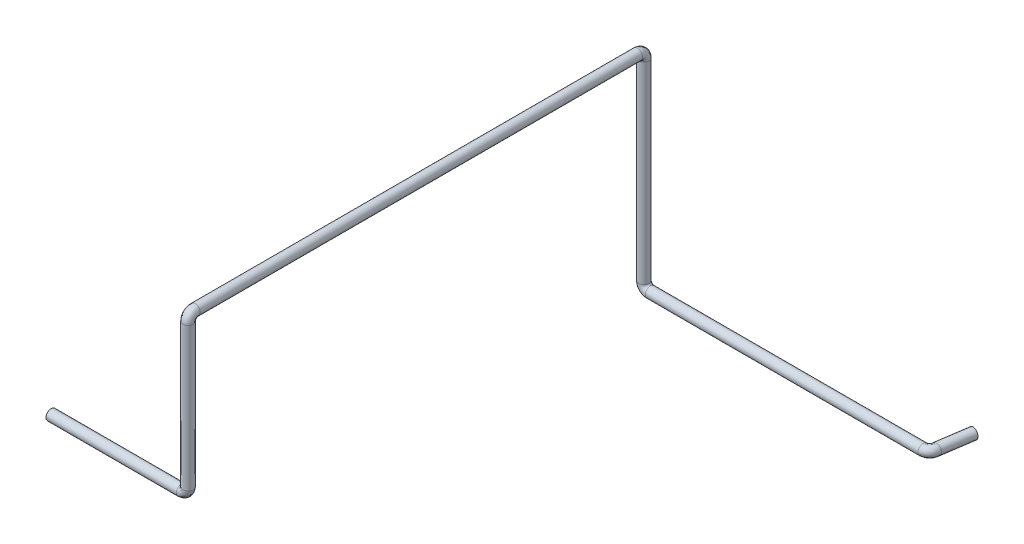
ISO-10303-21;
HEADER;
FILE_DESCRIPTION(('STEP AP214'),'2;1');
FILE_NAME('part.step','',(''),(''),'','','');
FILE_SCHEMA(('AUTOMOTIVE_DESIGN { 1 0 10303 214 1 1 1 1 }'));
ENDSEC;
DATA;
#1=APPLICATION_CONTEXT('core data for automotive mechanical design processes');
#2=APPLICATION_PROTOCOL_DEFINITION('international standard','automotive_design',2000,#1);
#3=PRODUCT_CONTEXT('',#1,'mechanical');
#4=PRODUCT('Part','Part','',(#3));
#5=PRODUCT_RELATED_PRODUCT_CATEGORY('part','',(#4));
#6=PRODUCT_DEFINITION_FORMATION('','',#4);
#7=PRODUCT_DEFINITION_CONTEXT('part definition',#1,'design');
#8=PRODUCT_DEFINITION('design','',#6,#7);
#9=PRODUCT_DEFINITION_SHAPE('','',#8);
#10=(LENGTH_UNIT() NAMED_UNIT(*) SI_UNIT(.MILLI.,.METRE.));
#11=(NAMED_UNIT(*) PLANE_ANGLE_UNIT() SI_UNIT($,.RADIAN.));
#12=(NAMED_UNIT(*) SI_UNIT($,.STERADIAN.) SOLID_ANGLE_UNIT());
#13=UNCERTAINTY_MEASURE_WITH_UNIT(LENGTH_MEASURE(1.E-05),#10,'distance_accuracy_value','');
#14=(GEOMETRIC_REPRESENTATION_CONTEXT(3) GLOBAL_UNCERTAINTY_ASSIGNED_CONTEXT((#13)) GLOBAL_UNIT_ASSIGNED_CONTEXT((#10,
#11,#12)) REPRESENTATION_CONTEXT('',''));
#15=CARTESIAN_POINT('',(0.,0.,0.));
#16=DIRECTION('',(0.,0.,1.));
#17=DIRECTION('',(1.,0.,0.));
#18=AXIS2_PLACEMENT_3D('',#15,#16,#17);
#19=CARTESIAN_POINT('',(21.9957932553289,-7.67008921079768,-69.9458668358255));
#20=DIRECTION('',(0.999999964203966,-0.00026756693960462,1.17321939738201E-12));
#21=DIRECTION('',(1.17290567079506E-12,-1.17267317397372E-12,-1.));
#22=AXIS2_PLACEMENT_3D('',#19,#20,#21);
#23=CIRCLE('',#22,0.793749999999999);
#24=DIRECTION('',(1.,0.,0.));
#25=VECTOR('',#24,1.);
#26=SURFACE_OF_LINEAR_EXTRUSION('',#23,#25);
#27=CARTESIAN_POINT('',(21.9955808740706,-8.46383918238458,-69.9458668358255));
#28=VERTEX_POINT('',#27);
#29=EDGE_CURVE('E62',#28,#28,#23,.T.);
#30=ORIENTED_EDGE('',*,*,#29,.T.);
#31=EDGE_LOOP('',(#30));
#32=FACE_BOUND('',#31,.T.);
#33=CARTESIAN_POINT('',(63.8407932553289,-7.67008921079768,-69.9458668358255));
#34=DIRECTION('',(0.999999964203966,-0.00026756693960462,1.17321939738201E-12));
#35=DIRECTION('',(1.17290567079506E-12,-1.17267317397372E-12,-1.));
#36=AXIS2_PLACEMENT_3D('',#33,#34,#35);
#37=CIRCLE('',#36,0.793749999999999);
#38=CARTESIAN_POINT('',(63.8407932553298,-7.67008921079861,-70.7396168358255));
#39=VERTEX_POINT('',#38);
#40=EDGE_CURVE('E11',#39,#39,#37,.T.);
#41=ORIENTED_EDGE('',*,*,#40,.F.);
#42=EDGE_LOOP('',(#41));
#43=FACE_BOUND('',#42,.T.);
#44=ADVANCED_FACE('F56',(#32,#43),#26,.T.);
#45=CARTESIAN_POINT('',(21.9960608222685,-6.6700892465937,-69.9458668358255));
#46=DIRECTION('',(-1.17267306976032E-12,0.,1.));
#47=DIRECTION('',(1.,0.,1.17267306976032E-12));
#48=AXIS2_PLACEMENT_3D('',#45,#46,#47);
#49=TOROIDAL_SURFACE('',#48,1.00000000000001,0.793749999999999);
#50=CARTESIAN_POINT('',(20.9960608222685,-6.6700892465937,-69.9458668358267));
#51=DIRECTION('',(0.,-1.,0.));
#52=DIRECTION('',(0.,0.,-1.));
#53=AXIS2_PLACEMENT_3D('',#50,#51,#52);
#54=CIRCLE('',#53,0.793749999999999);
#55=CARTESIAN_POINT('',(20.2023108222685,-6.6700892465937,-69.9458668358276));
#56=VERTEX_POINT('',#55);
#57=EDGE_CURVE('E95',#56,#56,#54,.T.);
#58=CARTESIAN_POINT('',(21.9960608222685,-6.6700892465937,-69.9458668358255));
#59=DIRECTION('',(-1.17267306976032E-12,0.,1.));
#60=DIRECTION('',(1.,0.,1.17267306976032E-12));
#61=AXIS2_PLACEMENT_3D('',#58,#59,#60);
#62=CIRCLE('',#61,1.79375000000001);
#63=EDGE_CURVE('',#56,#28,#62,.T.);
#64=ORIENTED_EDGE('',*,*,#57,.T.);
#65=ORIENTED_EDGE('',*,*,#29,.F.);
#66=ORIENTED_EDGE('',*,*,#63,.T.);
#67=ORIENTED_EDGE('',*,*,#63,.F.);
#68=EDGE_LOOP('',(#64,#66,#65,#67));
#69=FACE_BOUND('',#68,.T.);
#70=ADVANCED_FACE('F143',(#69),#49,.T.);
#71=CARTESIAN_POINT('',(20.,0.,0.));
#72=DIRECTION('',(-1.,0.,0.));
#73=DIRECTION('',(0.,0.,1.));
#74=AXIS2_PLACEMENT_3D('',#71,#72,#73);
#75=CYLINDRICAL_SURFACE('',#74,0.793749999999999);
#76=CARTESIAN_POINT('',(20.,0.,0.));
#77=DIRECTION('',(1.,0.,0.));
#78=DIRECTION('',(0.,0.,-1.));
#79=AXIS2_PLACEMENT_3D('',#76,#77,#78);
#80=CIRCLE('',#79,0.793749999999999);
#81=CARTESIAN_POINT('',(20.,0.,-0.793749999999999));
#82=VERTEX_POINT('',#81);
#83=EDGE_CURVE('E66',#82,#82,#80,.T.);
#84=ORIENTED_EDGE('',*,*,#83,.F.);
#85=EDGE_LOOP('',(#84));
#86=FACE_BOUND('',#85,.T.);
#87=CARTESIAN_POINT('',(0.,0.,0.));
#88=DIRECTION('',(1.,0.,0.));
#89=DIRECTION('',(0.,0.,-1.));
#90=AXIS2_PLACEMENT_3D('',#87,#88,#89);
#91=CIRCLE('',#90,0.793749999999999);
#92=CARTESIAN_POINT('',(0.,0.,-0.793749999999999));
#93=VERTEX_POINT('',#92);
#94=EDGE_CURVE('E70',#93,#93,#91,.T.);
#95=ORIENTED_EDGE('',*,*,#94,.T.);
#96=EDGE_LOOP('',(#95));
#97=FACE_BOUND('',#96,.T.);
#98=ADVANCED_FACE('F147',(#86,#97),#75,.T.);
#99=CARTESIAN_POINT('',(0.,0.,0.));
#100=DIRECTION('',(1.,0.,0.));
#101=DIRECTION('',(0.,0.,-1.));
#102=AXIS2_PLACEMENT_3D('',#99,#100,#101);
#103=PLANE('',#102);
#104=ORIENTED_EDGE('',*,*,#94,.F.);
#105=EDGE_LOOP('',(#104));
#106=FACE_BOUND('',#105,.T.);
#107=ADVANCED_FACE('F153',(#106),#103,.F.);
#108=CARTESIAN_POINT('',(20.,0.,-0.793749999999999));
#109=CARTESIAN_POINT('',(20.065279770204,0.,-0.793749999999999));
#110=CARTESIAN_POINT('',(20.1914878893359,0.0132172628994147,-0.79375));
#111=CARTESIAN_POINT('',(20.3996616530544,0.0772373758963046,-0.793749999999999));
#112=CARTESIAN_POINT('',(20.5896732684097,0.183509851019247,-0.793749999999999));
#113=CARTESIAN_POINT('',(20.7435293441814,0.319747904994038,-0.793749999999999));
#114=CARTESIAN_POINT('',(20.8740212526352,0.500909275893164,-0.793749999999999));
#115=CARTESIAN_POINT('',(20.9637701763745,0.712330300778528,-0.793749999999999));
#116=CARTESIAN_POINT('',(20.9899883978973,0.843115742960347,-0.793749999999999));
#117=CARTESIAN_POINT('',(20.9960608222739,0.911327352972007,-0.793749999999999));
#118=CARTESIAN_POINT('',(20.,1.5875,-0.793749999999999));
#119=CARTESIAN_POINT('',(20.065279770204,1.5875,-0.793749999999999));
#120=CARTESIAN_POINT('',(19.8038514776803,1.57619079827259,-0.793749999999999));
#121=CARTESIAN_POINT('',(19.7677475950457,1.53971736077893,-0.793749999999999));
#122=CARTESIAN_POINT('',(19.6385541781513,1.47434908763946,-0.793749999999999));
#123=CARTESIAN_POINT('',(19.5239226471976,1.36242127183502,-0.793749999999999));
#124=CARTESIAN_POINT('',(19.4533703039128,1.22491108057865,-0.793749999999998));
#125=CARTESIAN_POINT('',(19.4216012684054,1.18681215509875,-0.793749999999998));
#126=CARTESIAN_POINT('',(19.4024883978973,0.913638557488902,-0.793749999999998));
#127=CARTESIAN_POINT('',(19.4085608222739,0.981850167500561,-0.793749999999998));
#128=CARTESIAN_POINT('',(20.,1.5875,0.793749999999999));
#129=CARTESIAN_POINT('',(20.065279770204,1.5875,0.793749999999999));
#130=CARTESIAN_POINT('',(19.8038514776803,1.57619079827259,0.793749999999999));
#131=CARTESIAN_POINT('',(19.7677475950457,1.53971736077893,0.793749999999999));
#132=CARTESIAN_POINT('',(19.6385541781513,1.47434908763946,0.793749999999999));
#133=CARTESIAN_POINT('',(19.5239226471976,1.36242127183502,0.79375));
#134=CARTESIAN_POINT('',(19.4533703039128,1.22491108057865,0.79375));
#135=CARTESIAN_POINT('',(19.4216012684054,1.18681215509875,0.79375));
#136=CARTESIAN_POINT('',(19.4024883978973,0.913638557488902,0.793750000000001));
#137=CARTESIAN_POINT('',(19.4085608222739,0.981850167500561,0.793750000000001));
#138=CARTESIAN_POINT('',(20.,0.,0.793749999999999));
#139=CARTESIAN_POINT('',(20.065279770204,0.,0.793749999999999));
#140=CARTESIAN_POINT('',(20.1914878893359,0.0132172628994146,0.79375));
#141=CARTESIAN_POINT('',(20.3996616530544,0.0772373758963046,0.793749999999999));
#142=CARTESIAN_POINT('',(20.5896732684097,0.183509851019247,0.793749999999999));
#143=CARTESIAN_POINT('',(20.7435293441814,0.319747904994038,0.793749999999999));
#144=CARTESIAN_POINT('',(20.8740212526352,0.500909275893164,0.793749999999999));
#145=CARTESIAN_POINT('',(20.9637701763745,0.712330300778528,0.793749999999999));
#146=CARTESIAN_POINT('',(20.9899883978973,0.843115742960347,0.793749999999999));
#147=CARTESIAN_POINT('',(20.9960608222739,0.911327352972007,0.793749999999999));
#148=CARTESIAN_POINT('',(20.,-1.5875,0.79375));
#149=CARTESIAN_POINT('',(20.065279770204,-1.5875,0.79375));
#150=CARTESIAN_POINT('',(20.5791243009916,-1.54975627247376,0.793749999999999));
#151=CARTESIAN_POINT('',(21.031575711063,-1.38524260898632,0.79375));
#152=CARTESIAN_POINT('',(21.540792358668,-1.10732938560097,0.793749999999999));
#153=CARTESIAN_POINT('',(21.9631360411653,-0.722925461846948,0.79375));
#154=CARTESIAN_POINT('',(22.2946722013576,-0.223092528792315,0.793749999999998));
#155=CARTESIAN_POINT('',(22.5059390843435,0.237848446458302,0.793749999999998));
#156=CARTESIAN_POINT('',(22.5774883978973,0.772592928431793,0.793749999999998));
#157=CARTESIAN_POINT('',(22.5835608222739,0.840804538443452,0.793749999999998));
#158=CARTESIAN_POINT('',(20.,-1.5875,-0.793749999999999));
#159=CARTESIAN_POINT('',(20.065279770204,-1.5875,-0.793749999999999));
#160=CARTESIAN_POINT('',(20.5791243009916,-1.54975627247376,-0.793749999999999));
#161=CARTESIAN_POINT('',(21.031575711063,-1.38524260898632,-0.793749999999999));
#162=CARTESIAN_POINT('',(21.540792358668,-1.10732938560097,-0.79375));
#163=CARTESIAN_POINT('',(21.9631360411653,-0.722925461846948,-0.79375));
#164=CARTESIAN_POINT('',(22.2946722013576,-0.223092528792315,-0.79375));
#165=CARTESIAN_POINT('',(22.5059390843435,0.237848446458302,-0.79375));
#166=CARTESIAN_POINT('',(22.5774883978973,0.772592928431793,-0.793750000000001));
#167=CARTESIAN_POINT('',(22.5835608222739,0.840804538443452,-0.793750000000001));
#168=CARTESIAN_POINT('',(20.,0.,-0.793749999999999));
#169=CARTESIAN_POINT('',(20.065279770204,0.,-0.793749999999999));
#170=CARTESIAN_POINT('',(20.1914878893359,0.0132172628994147,-0.79375));
#171=CARTESIAN_POINT('',(20.3996616530544,0.0772373758963046,-0.793749999999999));
#172=CARTESIAN_POINT('',(20.5896732684097,0.183509851019247,-0.793749999999999));
#173=CARTESIAN_POINT('',(20.7435293441814,0.319747904994038,-0.793749999999999));
#174=CARTESIAN_POINT('',(20.8740212526352,0.500909275893164,-0.793749999999999));
#175=CARTESIAN_POINT('',(20.9637701763745,0.712330300778528,-0.793749999999999));
#176=CARTESIAN_POINT('',(20.9899883978973,0.843115742960347,-0.793749999999999));
#177=CARTESIAN_POINT('',(20.9960608222739,0.911327352972007,-0.793749999999999));
#178=(BOUNDED_SURFACE() B_SPLINE_SURFACE(3,3,((#108,#109,#110,#111,#112,#113,#114,#115,#116,
#117),(#118,#119,#120,#121,#122,#123,#124,#125,#126,#127),(#128,#129,#130,#131,#132,#133,#134,
#135,#136,#137),(#138,#139,#140,#141,#142,#143,#144,#145,#146,#147),(#148,#149,#150,#151,#152,
#153,#154,#155,#156,#157),(#158,#159,#160,#161,#162,#163,#164,#165,#166,#167),(#168,#169,#170,
#171,#172,#173,#174,#175,#176,#177)),.UNSPECIFIED.,.T.,.F.,.F.) B_SPLINE_SURFACE_WITH_KNOTS((4,
3,4),(4,1,1,1,1,1,1,4),(0.,0.5,1.),(0.,0.136322147353387,0.271272815336725,0.413325279073055,
0.565638666076814,0.715713661766442,0.857326161375628,1.),
.UNSPECIFIED.) GEOMETRIC_REPRESENTATION_ITEM() RATIONAL_B_SPLINE_SURFACE(((1.,1.,1.,1.,1.,1.,1.,
1.,1.,1.),(0.333333333333333,0.333333333333333,0.333333333333333,0.333333333333333,
0.333333333333333,0.333333333333333,0.333333333333333,0.333333333333333,0.333333333333333,
0.333333333333333),(0.333333333333333,0.333333333333333,0.333333333333333,0.333333333333333,
0.333333333333333,0.333333333333333,0.333333333333333,0.333333333333333,0.333333333333333,
0.333333333333333),(1.,1.,1.,1.,1.,1.,1.,1.,1.,1.),(0.333333333333333,0.333333333333333,
0.333333333333333,0.333333333333333,0.333333333333333,0.333333333333333,0.333333333333333,
0.333333333333333,0.333333333333333,0.333333333333333),(0.333333333333333,0.333333333333333,
0.333333333333333,0.333333333333333,0.333333333333333,0.333333333333333,0.333333333333333,
0.333333333333333,0.333333333333333,0.333333333333333),(1.,1.,1.,1.,1.,1.,1.,1.,1.,1.))) REPRESENTATION_ITEM('') SURFACE());
#179=CARTESIAN_POINT('',(20.9960608222739,0.911327352972007,-0.793749999999999));
#180=CARTESIAN_POINT('',(22.5835608222739,0.840804538443452,-0.793750000000001));
#181=CARTESIAN_POINT('',(22.5835608222739,0.840804538443452,0.793749999999998));
#182=CARTESIAN_POINT('',(20.9960608222739,0.911327352972007,0.793749999999999));
#183=CARTESIAN_POINT('',(19.4085608222739,0.981850167500561,0.793750000000001));
#184=CARTESIAN_POINT('',(19.4085608222739,0.981850167500561,-0.793749999999998));
#185=CARTESIAN_POINT('',(20.9960608222739,0.911327352972007,-0.793749999999999));
#186=(BOUNDED_CURVE() B_SPLINE_CURVE(3,(#179,#180,#181,#182,#183,#184,#185),.UNSPECIFIED.,.T.,
.F.) B_SPLINE_CURVE_WITH_KNOTS((4,3,4),(0.,0.5,1.),
.UNSPECIFIED.) CURVE() GEOMETRIC_REPRESENTATION_ITEM() RATIONAL_B_SPLINE_CURVE((1.,
0.333333333333333,0.333333333333333,1.,0.333333333333333,0.333333333333333,1.)) REPRESENTATION_ITEM(''));
#187=CARTESIAN_POINT('',(20.9960608222739,0.911327352972007,-0.793749999999999));
#188=VERTEX_POINT('',#187);
#189=EDGE_CURVE('E79',#188,#188,#186,.T.);
#190=ORIENTED_EDGE('',*,*,#83,.T.);
#191=EDGE_LOOP('',(#190));
#192=FACE_BOUND('',#191,.T.);
#193=ORIENTED_EDGE('',*,*,#189,.T.);
#194=EDGE_LOOP('',(#193));
#195=FACE_BOUND('',#194,.T.);
#196=ADVANCED_FACE('F160',(#192,#195),#178,.T.);
#197=CARTESIAN_POINT('',(20.9960608222739,0.911327352972007,-0.793749999999999));
#198=CARTESIAN_POINT('',(20.9960608222739,22.911327352972,-0.793749999999999));
#199=CARTESIAN_POINT('',(22.5835608222739,0.840804538443452,-0.793750000000001));
#200=CARTESIAN_POINT('',(22.5835608222739,22.911327352972,-0.793750000000001));
#201=CARTESIAN_POINT('',(22.5835608222739,0.840804538443452,0.793749999999998));
#202=CARTESIAN_POINT('',(22.5835608222739,22.911327352972,0.793749999999998));
#203=CARTESIAN_POINT('',(20.9960608222739,0.911327352972007,0.793749999999999));
#204=CARTESIAN_POINT('',(20.9960608222739,22.911327352972,0.793749999999999));
#205=CARTESIAN_POINT('',(19.4085608222739,0.981850167500561,0.793750000000001));
#206=CARTESIAN_POINT('',(19.4085608222739,22.911327352972,0.793750000000001));
#207=CARTESIAN_POINT('',(19.4085608222739,0.981850167500561,-0.793749999999998));
#208=CARTESIAN_POINT('',(19.4085608222739,22.911327352972,-0.793749999999998));
#209=CARTESIAN_POINT('',(20.9960608222739,0.911327352972007,-0.793749999999999));
#210=CARTESIAN_POINT('',(20.9960608222739,22.911327352972,-0.793749999999999));
#211=(BOUNDED_SURFACE() B_SPLINE_SURFACE(3,1,((#197,#198),(#199,#200),(#201,#202),(#203,#204),
(#205,#206),(#207,#208),(#209,#210)),.UNSPECIFIED.,.T.,.F.,.F.) B_SPLINE_SURFACE_WITH_KNOTS((4,
3,4),(2,2),(0.,0.5,1.),(0.,1.),
.UNSPECIFIED.) GEOMETRIC_REPRESENTATION_ITEM() RATIONAL_B_SPLINE_SURFACE(((1.,1.),
(0.333333333333333,0.333333333333333),(0.333333333333333,0.333333333333333),(1.,1.),
(0.333333333333333,0.333333333333333),(0.333333333333333,0.333333333333333),(1.,1.))) REPRESENTATION_ITEM('') SURFACE());
#212=CARTESIAN_POINT('',(20.9960608222739,22.911327352972,0.));
#213=DIRECTION('',(0.,1.,0.));
#214=DIRECTION('',(-1.,0.,0.));
#215=AXIS2_PLACEMENT_3D('',#212,#213,#214);
#216=CIRCLE('',#215,0.793749999999999);
#217=CARTESIAN_POINT('',(20.2023108222739,22.911327352972,0.));
#218=VERTEX_POINT('',#217);
#219=EDGE_CURVE('E75',#218,#218,#216,.T.);
#220=ORIENTED_EDGE('',*,*,#189,.F.);
#221=EDGE_LOOP('',(#220));
#222=FACE_BOUND('',#221,.T.);
#223=ORIENTED_EDGE('',*,*,#219,.F.);
#224=EDGE_LOOP('',(#223));
#225=FACE_BOUND('',#224,.T.);
#226=ADVANCED_FACE('F166',(#222,#225),#211,.F.);
#227=CARTESIAN_POINT('',(20.2023108222739,22.911327352972,0.));
#228=CARTESIAN_POINT('',(20.2023108222739,22.9669699019746,-0.00294481803164178));
#229=CARTESIAN_POINT('',(20.2023108222739,23.0769147564352,-0.00876352324384745));
#230=CARTESIAN_POINT('',(20.2023108222736,23.2594855599602,-0.0601959848019615));
#231=CARTESIAN_POINT('',(20.2023108222732,23.4330763366588,-0.142448008621294));
#232=CARTESIAN_POINT('',(20.2023108222726,23.5892678850576,-0.256628990866869));
#233=CARTESIAN_POINT('',(20.202310822272,23.7113560267948,-0.390586228220545));
#234=CARTESIAN_POINT('',(20.2023108222711,23.810559029688,-0.553946175697841));
#235=CARTESIAN_POINT('',(20.2023108222702,23.8764317607984,-0.733052526236658));
#236=CARTESIAN_POINT('',(20.2023108222694,23.9109992771942,-0.897004843017336));
#237=CARTESIAN_POINT('',(20.2023108222688,23.9092533815458,-1.01900501064942));
#238=CARTESIAN_POINT('',(20.2023108222685,23.9084383452381,-1.07595833788131));
#239=CARTESIAN_POINT('',(20.2023108222739,22.911327352972,1.5875));
#240=CARTESIAN_POINT('',(20.2023108222739,23.0647702590365,1.57916672380656));
#241=CARTESIAN_POINT('',(20.2023108222739,23.3679601429955,1.56270089226773));
#242=CARTESIAN_POINT('',(20.202310822273,23.8161749474953,1.43414806013336));
#243=CARTESIAN_POINT('',(20.2023108222723,24.2471071774012,1.23111673153646));
#244=CARTESIAN_POINT('',(20.2023108222706,24.6532955569666,0.936354774630397));
#245=CARTESIAN_POINT('',(20.2023108222685,24.9942282565509,0.562876855174698));
#246=CARTESIAN_POINT('',(20.2023108222663,25.248518606552,0.138425177014904));
#247=CARTESIAN_POINT('',(20.2023108222644,25.4114602640327,-0.299560008137403));
#248=CARTESIAN_POINT('',(20.2023108222623,25.4967264501313,-0.723651212254224));
#249=CARTESIAN_POINT('',(20.2023108222609,25.4961891656868,-1.00499690306889));
#250=CARTESIAN_POINT('',(20.2023108222603,25.4959383452381,-1.13633748648984));
#251=CARTESIAN_POINT('',(21.7898108222739,22.911327352972,1.5875));
#252=CARTESIAN_POINT('',(21.7898108222739,23.064770259037,1.57916672380652));
#253=CARTESIAN_POINT('',(21.7898108222739,23.3679601429969,1.5627008922676));
#254=CARTESIAN_POINT('',(21.789810822273,23.8161749474983,1.43414806013305));
#255=CARTESIAN_POINT('',(21.7898108222723,24.2471071774052,1.23111673153523));
#256=CARTESIAN_POINT('',(21.7898108222705,24.653295556972,0.936354774628486));
#257=CARTESIAN_POINT('',(21.7898108222685,24.9942282565577,0.562876855171618));
#258=CARTESIAN_POINT('',(21.7898108222663,25.2485186065595,0.138425177010345));
#259=CARTESIAN_POINT('',(21.7898108222644,25.4114602640405,-0.299560008142807));
#260=CARTESIAN_POINT('',(21.7898108222623,25.4967264501391,-0.723651212262655));
#261=CARTESIAN_POINT('',(21.7898108222609,25.4961891656949,-1.00499690307453));
#262=CARTESIAN_POINT('',(21.7898108222603,25.4959383452463,-1.13633748649416));
#263=CARTESIAN_POINT('',(21.7898108222739,22.911327352972,0.));
#264=CARTESIAN_POINT('',(21.7898108222739,22.9669699019751,-0.00294481803168381));
#265=CARTESIAN_POINT('',(21.7898108222739,23.0769147564367,-0.00876352324397274));
#266=CARTESIAN_POINT('',(21.7898108222736,23.2594855599631,-0.0601959848022707));
#267=CARTESIAN_POINT('',(21.7898108222732,23.4330763366628,-0.14244800862252));
#268=CARTESIAN_POINT('',(21.7898108222726,23.589267885063,-0.25662899086878));
#269=CARTESIAN_POINT('',(21.7898108222719,23.7113560268016,-0.390586228223626));
#270=CARTESIAN_POINT('',(21.7898108222711,23.8105590296955,-0.553946175702403));
#271=CARTESIAN_POINT('',(21.7898108222702,23.8764317608062,-0.733052526242061));
#272=CARTESIAN_POINT('',(21.7898108222694,23.910999277202,-0.897004843025767));
#273=CARTESIAN_POINT('',(21.7898108222688,23.9092533815539,-1.01900501065505));
#274=CARTESIAN_POINT('',(21.7898108222685,23.9084383452463,-1.07595833788564));
#275=CARTESIAN_POINT('',(21.7898108222739,22.911327352972,-1.5875));
#276=CARTESIAN_POINT('',(21.7898108222739,22.8691695449132,-1.58505635986989));
#277=CARTESIAN_POINT('',(21.7898108222739,22.7858693698764,-1.58022793875555));
#278=CARTESIAN_POINT('',(21.7898108222743,22.7027961724279,-1.55454002973759));
#279=CARTESIAN_POINT('',(21.7898108222742,22.6190454959204,-1.51601274878027));
#280=CARTESIAN_POINT('',(21.7898108222747,22.525240213154,-1.44961275636604));
#281=CARTESIAN_POINT('',(21.7898108222754,22.4284837970454,-1.34404931161887));
#282=CARTESIAN_POINT('',(21.7898108222759,22.3725994528315,-1.24631752841515));
#283=CARTESIAN_POINT('',(21.7898108222761,22.3414032575718,-1.16654504434132));
#284=CARTESIAN_POINT('',(21.7898108222764,22.325272104265,-1.07035847378888));
#285=CARTESIAN_POINT('',(21.7898108222766,22.322317597413,-1.03301311823557));
#286=CARTESIAN_POINT('',(21.7898108222767,22.3209383452463,-1.01557918927711));
#287=CARTESIAN_POINT('',(20.2023108222739,22.911327352972,-1.5875));
#288=CARTESIAN_POINT('',(20.2023108222739,22.8691695449127,-1.58505635986984));
#289=CARTESIAN_POINT('',(20.2023108222739,22.7858693698749,-1.58022793875543));
#290=CARTESIAN_POINT('',(20.2023108222743,22.702796172425,-1.55454002973728));
#291=CARTESIAN_POINT('',(20.2023108222742,22.6190454959163,-1.51601274877904));
#292=CARTESIAN_POINT('',(20.2023108222747,22.5252402131486,-1.44961275636413));
#293=CARTESIAN_POINT('',(20.2023108222754,22.4284837970387,-1.3440493116158));
#294=CARTESIAN_POINT('',(20.2023108222759,22.372599452824,-1.24631752841059));
#295=CARTESIAN_POINT('',(20.2023108222761,22.341403257564,-1.16654504433591));
#296=CARTESIAN_POINT('',(20.2023108222764,22.3252721042571,-1.07035847378045));
#297=CARTESIAN_POINT('',(20.2023108222766,22.3223175974049,-1.03301311822994));
#298=CARTESIAN_POINT('',(20.2023108222767,22.3209383452381,-1.01557918927278));
#299=CARTESIAN_POINT('',(20.2023108222739,22.911327352972,0.));
#300=CARTESIAN_POINT('',(20.2023108222739,22.9669699019746,-0.00294481803164178));
#301=CARTESIAN_POINT('',(20.2023108222739,23.0769147564352,-0.00876352324384745));
#302=CARTESIAN_POINT('',(20.2023108222736,23.2594855599602,-0.0601959848019615));
#303=CARTESIAN_POINT('',(20.2023108222732,23.4330763366588,-0.142448008621294));
#304=CARTESIAN_POINT('',(20.2023108222726,23.5892678850576,-0.256628990866869));
#305=CARTESIAN_POINT('',(20.202310822272,23.7113560267948,-0.390586228220545));
#306=CARTESIAN_POINT('',(20.2023108222711,23.810559029688,-0.553946175697841));
#307=CARTESIAN_POINT('',(20.2023108222702,23.8764317607984,-0.733052526236658));
#308=CARTESIAN_POINT('',(20.2023108222694,23.9109992771942,-0.897004843017336));
#309=CARTESIAN_POINT('',(20.2023108222688,23.9092533815458,-1.01900501064942));
#310=CARTESIAN_POINT('',(20.2023108222685,23.9084383452381,-1.07595833788131));
#311=(BOUNDED_SURFACE() B_SPLINE_SURFACE(3,3,((#227,#228,#229,#230,#231,#232,#233,#234,#235,
#236,#237,#238),(#239,#240,#241,#242,#243,#244,#245,#246,#247,#248,#249,#250),(#251,#252,#253,
#254,#255,#256,#257,#258,#259,#260,#261,#262),(#263,#264,#265,#266,#267,#268,#269,#270,#271,
#272,#273,#274),(#275,#276,#277,#278,#279,#280,#281,#282,#283,#284,#285,#286),(#287,#288,#289,
#290,#291,#292,#293,#294,#295,#296,#297,#298),(#299,#300,#301,#302,#303,#304,#305,#306,#307,
#308,#309,#310)),.UNSPECIFIED.,.T.,.F.,.F.) B_SPLINE_SURFACE_WITH_KNOTS((4,3,4),(4,1,1,1,1,1,1,
1,1,4),(0.,0.5,1.),(0.,0.110539535056959,0.218416541151145,0.329732005820936,0.448982114577769,
0.575716882163067,0.692249724299027,0.801320943722561,0.907250674110412,1.),
.UNSPECIFIED.) GEOMETRIC_REPRESENTATION_ITEM() RATIONAL_B_SPLINE_SURFACE(((1.,1.,1.,1.,1.,1.,1.,
1.,1.,1.,1.,1.),(0.333333333333333,0.333333333333333,0.333333333333333,0.333333333333334,
0.333333333333333,0.333333333333333,0.333333333333333,0.333333333333333,0.333333333333333,
0.333333333333333,0.333333333333333,0.333333333333333),(0.333333333333333,0.333333333333333,
0.333333333333333,0.333333333333334,0.333333333333333,0.333333333333333,0.333333333333333,
0.333333333333333,0.333333333333333,0.333333333333333,0.333333333333333,0.333333333333333),(1.,
1.,1.,1.,1.,1.,1.,1.,1.,1.,1.,1.),(0.333333333333333,0.333333333333333,0.333333333333333,
0.333333333333334,0.333333333333333,0.333333333333333,0.333333333333333,0.333333333333333,
0.333333333333333,0.333333333333333,0.333333333333333,0.333333333333333),(0.333333333333333,
0.333333333333333,0.333333333333333,0.333333333333334,0.333333333333333,0.333333333333333,
0.333333333333333,0.333333333333333,0.333333333333333,0.333333333333333,0.333333333333333,
0.333333333333333),(1.,1.,1.,1.,1.,1.,1.,1.,1.,1.,1.,1.))) REPRESENTATION_ITEM('') SURFACE());
#312=CARTESIAN_POINT('',(20.2023108222685,23.9084383452381,-1.07595833788131));
#313=CARTESIAN_POINT('',(20.2023108222767,22.3209383452381,-1.01557918927278));
#314=CARTESIAN_POINT('',(21.7898108222767,22.3209383452463,-1.01557918927711));
#315=CARTESIAN_POINT('',(21.7898108222685,23.9084383452463,-1.07595833788563));
#316=CARTESIAN_POINT('',(21.7898108222603,25.4959383452463,-1.13633748649416));
#317=CARTESIAN_POINT('',(20.2023108222603,25.4959383452381,-1.13633748648984));
#318=CARTESIAN_POINT('',(20.2023108222685,23.9084383452381,-1.07595833788131));
#319=(BOUNDED_CURVE() B_SPLINE_CURVE(3,(#312,#313,#314,#315,#316,#317,#318),.UNSPECIFIED.,.T.,
.F.) B_SPLINE_CURVE_WITH_KNOTS((4,3,4),(0.,0.5,1.),
.UNSPECIFIED.) CURVE() GEOMETRIC_REPRESENTATION_ITEM() RATIONAL_B_SPLINE_CURVE((1.,
0.333333333333333,0.333333333333333,1.,0.333333333333333,0.333333333333333,1.)) REPRESENTATION_ITEM(''));
#320=CARTESIAN_POINT('',(20.2023108222685,23.9084383452381,-1.07595833788131));
#321=VERTEX_POINT('',#320);
#322=EDGE_CURVE('E90',#321,#321,#319,.T.);
#323=ORIENTED_EDGE('',*,*,#219,.T.);
#324=EDGE_LOOP('',(#323));
#325=FACE_BOUND('',#324,.T.);
#326=ORIENTED_EDGE('',*,*,#322,.T.);
#327=EDGE_LOOP('',(#326));
#328=FACE_BOUND('',#327,.T.);
#329=ADVANCED_FACE('F177',(#325,#328),#311,.T.);
#330=CARTESIAN_POINT('',(20.2023108222685,23.9084383452381,-1.07595833788131));
#331=CARTESIAN_POINT('',(20.2023108222685,23.9084383452381,-68.9459583378835));
#332=CARTESIAN_POINT('',(20.2023108222767,22.3209383452381,-1.01557918927278));
#333=CARTESIAN_POINT('',(20.2023108222767,22.3209383452381,-68.9459583378835));
#334=CARTESIAN_POINT('',(21.7898108222767,22.3209383452463,-1.01557918927711));
#335=CARTESIAN_POINT('',(21.7898108222767,22.3209383452463,-68.9459583378835));
#336=CARTESIAN_POINT('',(21.7898108222685,23.9084383452463,-1.07595833788563));
#337=CARTESIAN_POINT('',(21.7898108222685,23.9084383452463,-68.9459583378835));
#338=CARTESIAN_POINT('',(21.7898108222603,25.4959383452463,-1.13633748649416));
#339=CARTESIAN_POINT('',(21.7898108222603,25.4959383452463,-68.9459583378835));
#340=CARTESIAN_POINT('',(20.2023108222603,25.4959383452381,-1.13633748648984));
#341=CARTESIAN_POINT('',(20.2023108222603,25.4959383452381,-68.9459583378835));
#342=CARTESIAN_POINT('',(20.2023108222685,23.9084383452381,-1.07595833788131));
#343=CARTESIAN_POINT('',(20.2023108222685,23.9084383452381,-68.9459583378835));
#344=(BOUNDED_SURFACE() B_SPLINE_SURFACE(3,1,((#330,#331),(#332,#333),(#334,#335),(#336,#337),
(#338,#339),(#340,#341),(#342,#343)),.UNSPECIFIED.,.T.,.F.,.F.) B_SPLINE_SURFACE_WITH_KNOTS((4,
3,4),(2,2),(0.,0.5,1.),(0.,1.),
.UNSPECIFIED.) GEOMETRIC_REPRESENTATION_ITEM() RATIONAL_B_SPLINE_SURFACE(((1.,1.),
(0.333333333333333,0.333333333333333),(0.333333333333333,0.333333333333333),(1.,1.),
(0.333333333333333,0.333333333333333),(0.333333333333333,0.333333333333333),(1.,1.))) REPRESENTATION_ITEM('') SURFACE());
#345=CARTESIAN_POINT('',(20.9960608222685,23.9084383452422,-68.9459583378835));
#346=DIRECTION('',(0.,0.,-1.));
#347=DIRECTION('',(-1.,0.,0.));
#348=AXIS2_PLACEMENT_3D('',#345,#346,#347);
#349=CIRCLE('',#348,0.793749999999999);
#350=CARTESIAN_POINT('',(20.2023108222685,23.9084383452422,-68.9459583378835));
#351=VERTEX_POINT('',#350);
#352=EDGE_CURVE('E84',#351,#351,#349,.T.);
#353=ORIENTED_EDGE('',*,*,#322,.F.);
#354=EDGE_LOOP('',(#353));
#355=FACE_BOUND('',#354,.T.);
#356=ORIENTED_EDGE('',*,*,#352,.F.);
#357=EDGE_LOOP('',(#356));
#358=FACE_BOUND('',#357,.T.);
#359=ADVANCED_FACE('F188',(#355,#358),#344,.F.);
#360=CARTESIAN_POINT('',(20.2023108222685,23.9084383452422,-68.9459583378835));
#361=CARTESIAN_POINT('',(20.2023108222685,23.9041104174008,-69.0138724066275));
#362=CARTESIAN_POINT('',(20.2023108222685,23.8955034510993,-69.1489333694024));
#363=CARTESIAN_POINT('',(20.2023108222685,23.8197869498467,-69.3710366587674));
#364=CARTESIAN_POINT('',(20.2023108222685,23.6995458337172,-69.5712135552353));
#365=CARTESIAN_POINT('',(20.2023108222685,23.5583381558505,-69.7152581659097));
#366=CARTESIAN_POINT('',(20.2023108222685,23.3918900135585,-69.8251720565901));
#367=CARTESIAN_POINT('',(20.2023108222685,23.2252944306286,-69.8964989503127));
#368=CARTESIAN_POINT('',(20.2023108222685,23.0553228433183,-69.9397169074428));
#369=CARTESIAN_POINT('',(20.2023108222685,22.9483089793747,-69.9438196381017));
#370=CARTESIAN_POINT('',(20.2023108222685,22.8949107534063,-69.9458668358267));
#371=CARTESIAN_POINT('',(20.2023108222685,25.4959383452422,-68.9459583378835));
#372=CARTESIAN_POINT('',(20.2023108222685,25.4839578155791,-69.1303183105004));
#373=CARTESIAN_POINT('',(20.2023108222685,25.4601320913843,-69.4969556782694));
#374=CARTESIAN_POINT('',(20.2023108222682,25.2727115112158,-70.0372750980927));
#375=CARTESIAN_POINT('',(20.2023108222686,24.97143043831,-70.5469702035156));
#376=CARTESIAN_POINT('',(20.2023108222679,24.5778165952976,-70.9484780590586));
#377=CARTESIAN_POINT('',(20.2023108222683,24.1466199195456,-71.2309139252545));
#378=CARTESIAN_POINT('',(20.2023108222687,23.7335442390485,-71.4073513457064));
#379=CARTESIAN_POINT('',(20.202310822268,23.3107877690214,-71.5158424228952));
#380=CARTESIAN_POINT('',(20.2023108222683,23.0261850117529,-71.5275332819955));
#381=CARTESIAN_POINT('',(20.2023108222685,22.8841727361113,-71.5333668358267));
#382=CARTESIAN_POINT('',(21.7898108222685,25.4959383452422,-68.9459583378835));
#383=CARTESIAN_POINT('',(21.7898108222685,25.4839578155792,-69.1303183105004));
#384=CARTESIAN_POINT('',(21.7898108222685,25.4601320913844,-69.4969556782694));
#385=CARTESIAN_POINT('',(21.7898108222682,25.2727115112161,-70.0372750980929));
#386=CARTESIAN_POINT('',(21.7898108222686,24.9714304383098,-70.5469702035155));
#387=CARTESIAN_POINT('',(21.7898108222679,24.577816595298,-70.9484780590591));
#388=CARTESIAN_POINT('',(21.7898108222683,24.1466199195457,-71.2309139252547));
#389=CARTESIAN_POINT('',(21.7898108222687,23.7335442390484,-71.4073513457063));
#390=CARTESIAN_POINT('',(21.789810822268,23.3107877690215,-71.5158424228956));
#391=CARTESIAN_POINT('',(21.7898108222683,23.0261850117529,-71.5275332819956));
#392=CARTESIAN_POINT('',(21.7898108222685,22.8841727361113,-71.5333668358267));
#393=CARTESIAN_POINT('',(21.7898108222685,23.9084383452422,-68.9459583378835));
#394=CARTESIAN_POINT('',(21.7898108222685,23.9041104174008,-69.0138724066275));
#395=CARTESIAN_POINT('',(21.7898108222685,23.8955034510993,-69.1489333694024));
#396=CARTESIAN_POINT('',(21.7898108222685,23.819786949847,-69.3710366587675));
#397=CARTESIAN_POINT('',(21.7898108222685,23.6995458337171,-69.5712135552353));
#398=CARTESIAN_POINT('',(21.7898108222685,23.5583381558509,-69.7152581659102));
#399=CARTESIAN_POINT('',(21.7898108222685,23.3918900135586,-69.8251720565902));
#400=CARTESIAN_POINT('',(21.7898108222685,23.2252944306285,-69.8964989503126));
#401=CARTESIAN_POINT('',(21.7898108222685,23.0553228433185,-69.9397169074433));
#402=CARTESIAN_POINT('',(21.7898108222685,22.9483089793747,-69.9438196381019));
#403=CARTESIAN_POINT('',(21.7898108222685,22.8949107534063,-69.9458668358267));
#404=CARTESIAN_POINT('',(21.7898108222685,22.3209383452422,-68.9459583378835));
#405=CARTESIAN_POINT('',(21.7898108222685,22.3242630192224,-68.8974265027546));
#406=CARTESIAN_POINT('',(21.7898108222685,22.3308748108142,-68.8009110605355));
#407=CARTESIAN_POINT('',(21.7898108222688,22.3668623884778,-68.7047982194422));
#408=CARTESIAN_POINT('',(21.7898108222683,22.4276612291243,-68.5954569069551));
#409=CARTESIAN_POINT('',(21.7898108222691,22.5388597164038,-68.4820382727613));
#410=CARTESIAN_POINT('',(21.7898108222687,22.6371601075714,-68.4194301879258));
#411=CARTESIAN_POINT('',(21.7898108222683,22.7170446222087,-68.3856465549188));
#412=CARTESIAN_POINT('',(21.789810822269,22.7998579176154,-68.363591391991));
#413=CARTESIAN_POINT('',(21.7898108222687,22.8704329469965,-68.3601059942081));
#414=CARTESIAN_POINT('',(21.7898108222685,22.9056487707013,-68.3583668358267));
#415=CARTESIAN_POINT('',(20.2023108222685,22.3209383452422,-68.9459583378835));
#416=CARTESIAN_POINT('',(20.2023108222685,22.3242630192224,-68.8974265027546));
#417=CARTESIAN_POINT('',(20.2023108222685,22.3308748108142,-68.8009110605354));
#418=CARTESIAN_POINT('',(20.2023108222688,22.3668623884776,-68.704798219442));
#419=CARTESIAN_POINT('',(20.2023108222683,22.4276612291245,-68.5954569069551));
#420=CARTESIAN_POINT('',(20.2023108222691,22.5388597164035,-68.4820382727607));
#421=CARTESIAN_POINT('',(20.2023108222687,22.6371601075713,-68.4194301879257));
#422=CARTESIAN_POINT('',(20.2023108222683,22.7170446222088,-68.3856465549189));
#423=CARTESIAN_POINT('',(20.202310822269,22.7998579176153,-68.3635913919905));
#424=CARTESIAN_POINT('',(20.2023108222687,22.8704329469964,-68.3601059942079));
#425=CARTESIAN_POINT('',(20.2023108222685,22.9056487707013,-68.3583668358267));
#426=CARTESIAN_POINT('',(20.2023108222685,23.9084383452422,-68.9459583378835));
#427=CARTESIAN_POINT('',(20.2023108222685,23.9041104174008,-69.0138724066275));
#428=CARTESIAN_POINT('',(20.2023108222685,23.8955034510993,-69.1489333694024));
#429=CARTESIAN_POINT('',(20.2023108222685,23.8197869498467,-69.3710366587674));
#430=CARTESIAN_POINT('',(20.2023108222685,23.6995458337172,-69.5712135552353));
#431=CARTESIAN_POINT('',(20.2023108222685,23.5583381558505,-69.7152581659097));
#432=CARTESIAN_POINT('',(20.2023108222685,23.3918900135585,-69.8251720565901));
#433=CARTESIAN_POINT('',(20.2023108222685,23.2252944306286,-69.8964989503127));
#434=CARTESIAN_POINT('',(20.2023108222685,23.0553228433183,-69.9397169074428));
#435=CARTESIAN_POINT('',(20.2023108222685,22.9483089793747,-69.9438196381017));
#436=CARTESIAN_POINT('',(20.2023108222685,22.8949107534063,-69.9458668358267));
#437=(BOUNDED_SURFACE() B_SPLINE_SURFACE(3,3,((#360,#361,#362,#363,#364,#365,#366,#367,#368,
#369,#370),(#371,#372,#373,#374,#375,#376,#377,#378,#379,#380,#381),(#382,#383,#384,#385,#386,
#387,#388,#389,#390,#391,#392),(#393,#394,#395,#396,#397,#398,#399,#400,#401,#402,#403),(#404,
#405,#406,#407,#408,#409,#410,#411,#412,#413,#414),(#415,#416,#417,#418,#419,#420,#421,#422,
#423,#424,#425),(#426,#427,#428,#429,#430,#431,#432,#433,#434,#435,#436)),.UNSPECIFIED.,.T.,.F.,
.F.) B_SPLINE_SURFACE_WITH_KNOTS((4,3,4),(4,1,1,1,1,1,1,1,4),(0.,0.5,1.),(0.,0.1360410797546,
0.270545404632539,0.413319569603741,0.567755770994858,0.682495739116712,0.790366550166581,
0.895396223328344,1.),
.UNSPECIFIED.) GEOMETRIC_REPRESENTATION_ITEM() RATIONAL_B_SPLINE_SURFACE(((1.,1.,1.,1.,1.,1.,1.,
1.,1.,1.,1.),(0.333333333333333,0.333333333333333,0.333333333333333,0.333333333333333,
0.333333333333333,0.333333333333333,0.333333333333333,0.333333333333333,0.333333333333333,
0.333333333333333,0.333333333333333),(0.333333333333333,0.333333333333333,0.333333333333333,
0.333333333333333,0.333333333333333,0.333333333333333,0.333333333333333,0.333333333333333,
0.333333333333333,0.333333333333333,0.333333333333333),(1.,1.,1.,1.,1.,1.,1.,1.,1.,1.,1.),
(0.333333333333333,0.333333333333333,0.333333333333333,0.333333333333333,0.333333333333333,
0.333333333333333,0.333333333333333,0.333333333333333,0.333333333333333,0.333333333333333,
0.333333333333333),(0.333333333333333,0.333333333333333,0.333333333333333,0.333333333333333,
0.333333333333333,0.333333333333333,0.333333333333333,0.333333333333333,0.333333333333333,
0.333333333333333,0.333333333333333),(1.,1.,1.,1.,1.,1.,1.,1.,1.,1.,1.))) REPRESENTATION_ITEM('') SURFACE());
#438=CARTESIAN_POINT('',(20.2023108222685,22.8949107534063,-69.9458668358267));
#439=CARTESIAN_POINT('',(20.2023108222685,22.9056487707013,-68.3583668358267));
#440=CARTESIAN_POINT('',(21.7898108222685,22.9056487707013,-68.3583668358267));
#441=CARTESIAN_POINT('',(21.7898108222685,22.8949107534063,-69.9458668358267));
#442=CARTESIAN_POINT('',(21.7898108222685,22.8841727361113,-71.5333668358267));
#443=CARTESIAN_POINT('',(20.2023108222685,22.8841727361113,-71.5333668358267));
#444=CARTESIAN_POINT('',(20.2023108222685,22.8949107534063,-69.9458668358267));
#445=(BOUNDED_CURVE() B_SPLINE_CURVE(3,(#438,#439,#440,#441,#442,#443,#444),.UNSPECIFIED.,.T.,
.F.) B_SPLINE_CURVE_WITH_KNOTS((4,3,4),(0.,0.5,1.),
.UNSPECIFIED.) CURVE() GEOMETRIC_REPRESENTATION_ITEM() RATIONAL_B_SPLINE_CURVE((1.,
0.333333333333333,0.333333333333333,1.,0.333333333333333,0.333333333333333,1.)) REPRESENTATION_ITEM(''));
#446=CARTESIAN_POINT('',(20.2023108222685,22.8949107534063,-69.9458668358267));
#447=VERTEX_POINT('',#446);
#448=EDGE_CURVE('E101',#447,#447,#445,.T.);
#449=ORIENTED_EDGE('',*,*,#352,.T.);
#450=EDGE_LOOP('',(#449));
#451=FACE_BOUND('',#450,.T.);
#452=ORIENTED_EDGE('',*,*,#448,.T.);
#453=EDGE_LOOP('',(#452));
#454=FACE_BOUND('',#453,.T.);
#455=ADVANCED_FACE('F199',(#451,#454),#437,.T.);
#456=CARTESIAN_POINT('',(20.2023108222685,22.8949107534063,-69.9458668358267));
#457=CARTESIAN_POINT('',(20.2023108222685,-6.6700892465937,-69.9458668358267));
#458=CARTESIAN_POINT('',(20.2023108222685,22.9056487707013,-68.3583668358267));
#459=CARTESIAN_POINT('',(20.2023108222685,-6.6700892465937,-68.3583668358267));
#460=CARTESIAN_POINT('',(21.7898108222685,22.9056487707013,-68.3583668358267));
#461=CARTESIAN_POINT('',(21.7898108222685,-6.6700892465937,-68.3583668358267));
#462=CARTESIAN_POINT('',(21.7898108222685,22.8949107534063,-69.9458668358267));
#463=CARTESIAN_POINT('',(21.7898108222685,-6.6700892465937,-69.9458668358267));
#464=CARTESIAN_POINT('',(21.7898108222685,22.8841727361113,-71.5333668358267));
#465=CARTESIAN_POINT('',(21.7898108222685,-6.6700892465937,-71.5333668358267));
#466=CARTESIAN_POINT('',(20.2023108222685,22.8841727361113,-71.5333668358267));
#467=CARTESIAN_POINT('',(20.2023108222685,-6.6700892465937,-71.5333668358267));
#468=CARTESIAN_POINT('',(20.2023108222685,22.8949107534063,-69.9458668358267));
#469=CARTESIAN_POINT('',(20.2023108222685,-6.6700892465937,-69.9458668358267));
#470=(BOUNDED_SURFACE() B_SPLINE_SURFACE(3,1,((#456,#457),(#458,#459),(#460,#461),(#462,#463),
(#464,#465),(#466,#467),(#468,#469)),.UNSPECIFIED.,.T.,.F.,.F.) B_SPLINE_SURFACE_WITH_KNOTS((4,
3,4),(2,2),(0.,0.5,1.),(0.,1.),
.UNSPECIFIED.) GEOMETRIC_REPRESENTATION_ITEM() RATIONAL_B_SPLINE_SURFACE(((1.,1.),
(0.333333333333333,0.333333333333333),(0.333333333333333,0.333333333333333),(1.,1.),
(0.333333333333333,0.333333333333333),(0.333333333333333,0.333333333333333),(1.,1.))) REPRESENTATION_ITEM('') SURFACE());
#471=ORIENTED_EDGE('',*,*,#448,.F.);
#472=EDGE_LOOP('',(#471));
#473=FACE_BOUND('',#472,.T.);
#474=ORIENTED_EDGE('',*,*,#57,.F.);
#475=EDGE_LOOP('',(#474));
#476=FACE_BOUND('',#475,.T.);
#477=ADVANCED_FACE('F140',(#473,#476),#470,.F.);
#478=CARTESIAN_POINT('',(63.8407932553298,-7.67008921079861,-70.7396168358255));
#479=CARTESIAN_POINT('',(63.8479804842891,-7.67008921096692,-70.7399744090421));
#480=CARTESIAN_POINT('',(63.8629045492727,-7.67008921131642,-70.7407168990824));
#481=CARTESIAN_POINT('',(63.9102316276233,-7.67008920850561,-70.7531198696387));
#482=CARTESIAN_POINT('',(63.9533563074921,-7.6700892197848,-70.7737574843797));
#483=CARTESIAN_POINT('',(63.9849681183868,-7.67008917676405,-70.7971899728202));
#484=CARTESIAN_POINT('',(63.9991172595357,-7.67008933707308,-70.8130965918948));
#485=CARTESIAN_POINT('',(64.020800873636,-7.67008875346607,-70.844784601624));
#486=CARTESIAN_POINT('',(64.0375325345515,-7.67009086735359,-70.8962907761525));
#487=CARTESIAN_POINT('',(64.0485038955293,-7.67008325986841,-70.9164752209541));
#488=CARTESIAN_POINT('',(64.0438247562467,-7.67010214014893,-71.0001784236403));
#489=CARTESIAN_POINT('',(64.0414775248847,-7.67011161120416,-71.042167082362));
#490=CARTESIAN_POINT('',(63.8412180178465,-6.08258926762482,-70.7396168358274));
#491=CARTESIAN_POINT('',(63.8484036642199,-6.08258926779228,-70.7400008900924));
#492=CARTESIAN_POINT('',(63.8633244430116,-6.08258926814,-70.7407983672343));
#493=CARTESIAN_POINT('',(63.9106316836858,-6.08258926534345,-70.7532675318594));
#494=CARTESIAN_POINT('',(63.9537257287071,-6.08258927656541,-70.7739716450013));
#495=CARTESIAN_POINT('',(63.9852911219423,-6.08258923376293,-70.7974711343786));
#496=CARTESIAN_POINT('',(63.9993728064936,-6.08258939325862,-70.8134373659687));
#497=CARTESIAN_POINT('',(64.0209876505907,-6.08258881261263,-70.8451768718359));
#498=CARTESIAN_POINT('',(64.0376551242778,-6.08259091577497,-70.8966685331792));
#499=CARTESIAN_POINT('',(64.0485473834242,-6.08258334688771,-70.917012381202));
#500=CARTESIAN_POINT('',(64.043839283824,-6.0826021313758,-71.0003578675445));
#501=CARTESIAN_POINT('',(64.0414775248829,-6.08261155437796,-71.0421670823621));
#502=CARTESIAN_POINT('',(63.8412180178446,-6.08258926762296,-69.1521168358274));
#503=CARTESIAN_POINT('',(63.9473854559636,-6.08258926745379,-69.158415099309));
#504=CARTESIAN_POINT('',(64.1678389512691,-6.08258926710252,-69.1714932541883));
#505=CARTESIAN_POINT('',(64.4623386229749,-6.0825892699276,-69.258112067006));
#506=CARTESIAN_POINT('',(64.7547656667996,-6.08258925859117,-69.3932755544977));
#507=CARTESIAN_POINT('',(65.0336762958881,-6.0825893018302,-69.5903882020881));
#508=CARTESIAN_POINT('',(65.2819660590545,-6.08258914070781,-69.8579713909486));
#509=CARTESIAN_POINT('',(65.4544913870925,-6.08258972727586,-70.1485296615786));
#510=CARTESIAN_POINT('',(65.5674171445604,-6.08258760266316,-70.4333975276281));
#511=CARTESIAN_POINT('',(65.632440321673,-6.08259524874625,-70.7728251095049));
#512=CARTESIAN_POINT('',(65.6350033660104,-6.0825762726733,-70.9062082634995));
#513=CARTESIAN_POINT('',(65.6362890849616,-6.082566753565,-70.9731182448691));
#514=CARTESIAN_POINT('',(63.840793255328,-7.67008921079675,-69.1521168358255));
#515=CARTESIAN_POINT('',(63.9469622760328,-7.67008921062844,-69.1583886182586));
#516=CARTESIAN_POINT('',(64.1674190575302,-7.67008921027894,-69.1714117860364));
#517=CARTESIAN_POINT('',(64.4619385669124,-7.67008921308976,-69.2579644047853));
#518=CARTESIAN_POINT('',(64.7543962455846,-7.67008920181056,-69.393061393876));
#519=CARTESIAN_POINT('',(65.0333532923326,-7.67008924483131,-69.5901070405297));
#520=CARTESIAN_POINT('',(65.2817105120966,-7.67008908452228,-69.8576306168747));
#521=CARTESIAN_POINT('',(65.4543046101379,-7.67008966812929,-70.1481373913667));
#522=CARTESIAN_POINT('',(65.567294554834,-7.67008755424178,-70.4330197706015));
#523=CARTESIAN_POINT('',(65.6323968337782,-7.67009516172696,-70.7722879492569));
#524=CARTESIAN_POINT('',(65.6349888384332,-7.67007628144643,-70.9060288195953));
#525=CARTESIAN_POINT('',(65.6362890849634,-7.6700668103912,-70.973118244869));
#526=CARTESIAN_POINT('',(63.8403684928114,-9.25758915397055,-69.1521168358237));
#527=CARTESIAN_POINT('',(63.946539096102,-9.25758915380309,-69.1583621372083));
#528=CARTESIAN_POINT('',(64.1669991637912,-9.25758915345537,-69.1713303178845));
#529=CARTESIAN_POINT('',(64.4615385108499,-9.25758915625192,-69.2578167425646));
#530=CARTESIAN_POINT('',(64.7540268243696,-9.25758914502995,-69.3928472332544));
#531=CARTESIAN_POINT('',(65.0330302887771,-9.25758918783242,-69.5898258789712));
#532=CARTESIAN_POINT('',(65.2814549651386,-9.25758902833675,-69.8572898428009));
#533=CARTESIAN_POINT('',(65.4541178331832,-9.25758960898273,-70.1477451211548));
#534=CARTESIAN_POINT('',(65.5671719651078,-9.2575875058204,-70.4326420135748));
#535=CARTESIAN_POINT('',(65.6323533458834,-9.25759507470766,-70.7717507890089));
#536=CARTESIAN_POINT('',(65.634974310856,-9.25757629021957,-70.9058493756911));
#537=CARTESIAN_POINT('',(65.6362890849653,-9.25756686721741,-70.9731182448689));
#538=CARTESIAN_POINT('',(63.8403684928132,-9.25758915397241,-70.7396168358237));
#539=CARTESIAN_POINT('',(63.8475573043583,-9.25758915414158,-70.7399479279917));
#540=CARTESIAN_POINT('',(63.8624846555338,-9.25758915449284,-70.7406354309305));
#541=CARTESIAN_POINT('',(63.9098315715607,-9.25758915166777,-70.752972207418));
#542=CARTESIAN_POINT('',(63.9529868862772,-9.25758916300419,-70.773543323758));
#543=CARTESIAN_POINT('',(63.9846451148312,-9.25758911976516,-70.7969088112618));
#544=CARTESIAN_POINT('',(63.9988617125778,-9.25758928088755,-70.812755817821));
#545=CARTESIAN_POINT('',(64.0206140966814,-9.2575886943195,-70.8443923314121));
#546=CARTESIAN_POINT('',(64.0374099448253,-9.2575908189322,-70.8959130191258));
#547=CARTESIAN_POINT('',(64.0484604076345,-9.25758317284911,-70.9159380607061));
#548=CARTESIAN_POINT('',(64.0438102286695,-9.25760214892207,-70.999998979736));
#549=CARTESIAN_POINT('',(64.0414775248865,-9.25761166803036,-71.0421670823619));
#550=CARTESIAN_POINT('',(63.8407932553298,-7.67008921079861,-70.7396168358255));
#551=CARTESIAN_POINT('',(63.8479804842891,-7.67008921096692,-70.7399744090421));
#552=CARTESIAN_POINT('',(63.8629045492727,-7.67008921131642,-70.7407168990824));
#553=CARTESIAN_POINT('',(63.9102316276233,-7.67008920850561,-70.7531198696387));
#554=CARTESIAN_POINT('',(63.9533563074921,-7.6700892197848,-70.7737574843797));
#555=CARTESIAN_POINT('',(63.9849681183868,-7.67008917676405,-70.7971899728202));
#556=CARTESIAN_POINT('',(63.9991172595357,-7.67008933707308,-70.8130965918948));
#557=CARTESIAN_POINT('',(64.020800873636,-7.67008875346607,-70.844784601624));
#558=CARTESIAN_POINT('',(64.0375325345515,-7.67009086735359,-70.8962907761525));
#559=CARTESIAN_POINT('',(64.0485038955293,-7.67008325986841,-70.9164752209541));
#560=CARTESIAN_POINT('',(64.0438247562467,-7.67010214014893,-71.0001784236403));
#561=CARTESIAN_POINT('',(64.0414775248847,-7.67011161120416,-71.042167082362));
#562=(BOUNDED_SURFACE() B_SPLINE_SURFACE(3,3,((#478,#479,#480,#481,#482,#483,#484,#485,#486,
#487,#488,#489),(#490,#491,#492,#493,#494,#495,#496,#497,#498,#499,#500,#501),(#502,#503,#504,
#505,#506,#507,#508,#509,#510,#511,#512,#513),(#514,#515,#516,#517,#518,#519,#520,#521,#522,
#523,#524,#525),(#526,#527,#528,#529,#530,#531,#532,#533,#534,#535,#536,#537),(#538,#539,#540,
#541,#542,#543,#544,#545,#546,#547,#548,#549),(#550,#551,#552,#553,#554,#555,#556,#557,#558,
#559,#560,#561)),.UNSPECIFIED.,.T.,.F.,.F.) B_SPLINE_SURFACE_WITH_KNOTS((4,3,4),(4,1,1,1,1,1,1,
1,1,4),(0.,0.5,1.),(0.,0.10219792814853,0.212210927121196,0.326347630887889,0.441966020382725,
0.557975286698188,0.671492022047256,0.783484268274616,0.891387606739671,1.),
.UNSPECIFIED.) GEOMETRIC_REPRESENTATION_ITEM() RATIONAL_B_SPLINE_SURFACE(((1.,1.,1.,1.,1.,1.,1.,
1.,1.,1.,1.,1.),(0.333333333333333,0.333333333333333,0.333333333333333,0.333333333333333,
0.333333333333333,0.333333333333333,0.333333333333333,0.333333333333334,0.333333333333333,
0.333333333333333,0.333333333333333,0.333333333333333),(0.333333333333333,0.333333333333333,
0.333333333333333,0.333333333333333,0.333333333333333,0.333333333333333,0.333333333333333,
0.333333333333334,0.333333333333333,0.333333333333333,0.333333333333333,0.333333333333333),(1.,
1.,1.,1.,1.,1.,1.,1.,1.,1.,1.,1.),(0.333333333333333,0.333333333333333,0.333333333333333,
0.333333333333333,0.333333333333333,0.333333333333333,0.333333333333333,0.333333333333334,
0.333333333333333,0.333333333333333,0.333333333333333,0.333333333333333),(0.333333333333333,
0.333333333333333,0.333333333333333,0.333333333333333,0.333333333333333,0.333333333333333,
0.333333333333333,0.333333333333334,0.333333333333333,0.333333333333333,0.333333333333333,
0.333333333333333),(1.,1.,1.,1.,1.,1.,1.,1.,1.,1.,1.,1.))) REPRESENTATION_ITEM('') SURFACE());
#563=CARTESIAN_POINT('',(64.0414775248847,-7.67011161120416,-71.042167082362));
#564=CARTESIAN_POINT('',(64.0414775248865,-9.25761166803036,-71.0421670823619));
#565=CARTESIAN_POINT('',(65.6362890849653,-9.25756686721741,-70.9731182448689));
#566=CARTESIAN_POINT('',(65.6362890849634,-7.6700668103912,-70.973118244869));
#567=CARTESIAN_POINT('',(65.6362890849616,-6.082566753565,-70.9731182448691));
#568=CARTESIAN_POINT('',(64.0414775248829,-6.08261155437796,-71.0421670823621));
#569=CARTESIAN_POINT('',(64.0414775248847,-7.67011161120416,-71.042167082362));
#570=(BOUNDED_CURVE() B_SPLINE_CURVE(3,(#563,#564,#565,#566,#567,#568,#569),.UNSPECIFIED.,.T.,
.F.) B_SPLINE_CURVE_WITH_KNOTS((4,3,4),(0.,0.5,1.),
.UNSPECIFIED.) CURVE() GEOMETRIC_REPRESENTATION_ITEM() RATIONAL_B_SPLINE_CURVE((1.,
0.333333333333333,0.333333333333333,1.,0.333333333333333,0.333333333333333,1.)) REPRESENTATION_ITEM(''));
#571=CARTESIAN_POINT('',(64.0414775248847,-7.67011161120416,-71.042167082362));
#572=VERTEX_POINT('',#571);
#573=EDGE_CURVE('E114',#572,#572,#570,.T.);
#574=ORIENTED_EDGE('',*,*,#40,.T.);
#575=EDGE_LOOP('',(#574));
#576=FACE_BOUND('',#575,.T.);
#577=ORIENTED_EDGE('',*,*,#573,.T.);
#578=EDGE_LOOP('',(#577));
#579=FACE_BOUND('',#578,.T.);
#580=ADVANCED_FACE('F126',(#576,#579),#562,.T.);
#581=CARTESIAN_POINT('',(66.3629617021155,-7.6700668103912,-75.835398260341));
#582=DIRECTION('',(0.147809411129615,0.,-0.989015863361916));
#583=DIRECTION('',(-0.989015863361916,0.,-0.147809411129615));
#584=AXIS2_PLACEMENT_3D('',#581,#582,#583);
#585=PLANE('',#584);
#586=CARTESIAN_POINT('',(64.7928990190287,-7.67011161120416,-76.0700457005092));
#587=CARTESIAN_POINT('',(64.7928990190305,-9.25761166803036,-76.0700457005089));
#588=CARTESIAN_POINT('',(66.3629617021173,-9.25756686721741,-75.8353982603407));
#589=CARTESIAN_POINT('',(66.3629617021155,-7.6700668103912,-75.835398260341));
#590=CARTESIAN_POINT('',(66.3629617021138,-6.082566753565,-75.8353982603412));
#591=CARTESIAN_POINT('',(64.7928990190269,-6.08261155437796,-76.0700457005095));
#592=CARTESIAN_POINT('',(64.7928990190287,-7.67011161120416,-76.0700457005092));
#593=(BOUNDED_CURVE() B_SPLINE_CURVE(3,(#586,#587,#588,#589,#590,#591,#592),.UNSPECIFIED.,.T.,
.F.) B_SPLINE_CURVE_WITH_KNOTS((4,3,4),(0.,0.5,1.),
.UNSPECIFIED.) CURVE() GEOMETRIC_REPRESENTATION_ITEM() RATIONAL_B_SPLINE_CURVE((1.,
0.333333333333333,0.333333333333333,1.,0.333333333333333,0.333333333333333,1.)) REPRESENTATION_ITEM(''));
#594=CARTESIAN_POINT('',(64.7928990190287,-7.67011161120416,-76.0700457005092));
#595=VERTEX_POINT('',#594);
#596=EDGE_CURVE('E106',#595,#595,#593,.F.);
#597=ORIENTED_EDGE('',*,*,#596,.T.);
#598=EDGE_LOOP('',(#597));
#599=FACE_BOUND('',#598,.T.);
#600=ADVANCED_FACE('F131',(#599),#585,.T.);
#601=CARTESIAN_POINT('',(64.0414775248847,-7.67011161120416,-71.042167082362));
#602=CARTESIAN_POINT('',(64.7928990190287,-7.67011161120416,-76.0700457005092));
#603=CARTESIAN_POINT('',(64.0414775248865,-9.25761166803036,-71.0421670823619));
#604=CARTESIAN_POINT('',(64.7928990190305,-9.25761166803036,-76.0700457005089));
#605=CARTESIAN_POINT('',(65.6362890849653,-9.25756686721741,-70.9731182448689));
#606=CARTESIAN_POINT('',(66.3629617021173,-9.25756686721741,-75.8353982603407));
#607=CARTESIAN_POINT('',(65.6362890849634,-7.6700668103912,-70.973118244869));
#608=CARTESIAN_POINT('',(66.3629617021155,-7.6700668103912,-75.835398260341));
#609=CARTESIAN_POINT('',(65.6362890849616,-6.082566753565,-70.9731182448691));
#610=CARTESIAN_POINT('',(66.3629617021138,-6.082566753565,-75.8353982603412));
#611=CARTESIAN_POINT('',(64.0414775248829,-6.08261155437796,-71.0421670823621));
#612=CARTESIAN_POINT('',(64.7928990190269,-6.08261155437796,-76.0700457005095));
#613=CARTESIAN_POINT('',(64.0414775248847,-7.67011161120416,-71.042167082362));
#614=CARTESIAN_POINT('',(64.7928990190287,-7.67011161120416,-76.0700457005092));
#615=(BOUNDED_SURFACE() B_SPLINE_SURFACE(3,1,((#601,#602),(#603,#604),(#605,#606),(#607,#608),
(#609,#610),(#611,#612),(#613,#614)),.UNSPECIFIED.,.T.,.F.,.F.) B_SPLINE_SURFACE_WITH_KNOTS((4,
3,4),(2,2),(0.,0.5,1.),(0.,1.),
.UNSPECIFIED.) GEOMETRIC_REPRESENTATION_ITEM() RATIONAL_B_SPLINE_SURFACE(((1.,1.),
(0.333333333333333,0.333333333333333),(0.333333333333333,0.333333333333333),(1.,1.),
(0.333333333333333,0.333333333333333),(0.333333333333333,0.333333333333333),(1.,1.))) REPRESENTATION_ITEM('') SURFACE());
#616=ORIENTED_EDGE('',*,*,#573,.F.);
#617=EDGE_LOOP('',(#616));
#618=FACE_BOUND('',#617,.T.);
#619=ORIENTED_EDGE('',*,*,#596,.F.);
#620=EDGE_LOOP('',(#619));
#621=FACE_BOUND('',#620,.T.);
#622=ADVANCED_FACE('F128',(#618,#621),#615,.F.);
#623=CLOSED_SHELL('',(#44,#70,#98,#107,#196,#226,#329,#359,#455,#477,#580,#600,#622));
#624=MANIFOLD_SOLID_BREP('B2',#623);
#625=ADVANCED_BREP_SHAPE_REPRESENTATION('',(#18,#624),#14);
#626=SHAPE_DEFINITION_REPRESENTATION(#9,#625);
ENDSEC;
END-ISO-10303-21;
